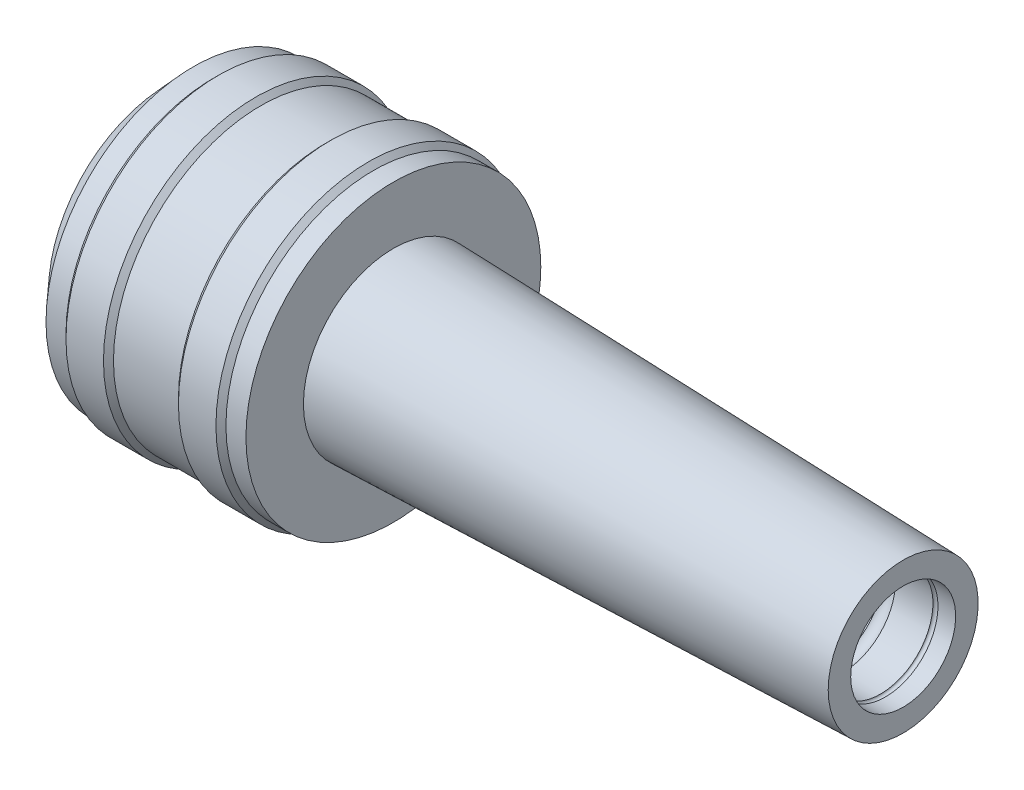
ISO-10303-21;
HEADER;
FILE_DESCRIPTION(('STEP AP214'),'2;1');
FILE_NAME('part.step','',(''),(''),'','','');
FILE_SCHEMA(('AUTOMOTIVE_DESIGN { 1 0 10303 214 1 1 1 1 }'));
ENDSEC;
DATA;
#1=APPLICATION_CONTEXT('core data for automotive mechanical design processes');
#2=APPLICATION_PROTOCOL_DEFINITION('international standard','automotive_design',2000,#1);
#3=PRODUCT_CONTEXT('',#1,'mechanical');
#4=PRODUCT('Part','Part','',(#3));
#5=PRODUCT_RELATED_PRODUCT_CATEGORY('part','',(#4));
#6=PRODUCT_DEFINITION_FORMATION('','',#4);
#7=PRODUCT_DEFINITION_CONTEXT('part definition',#1,'design');
#8=PRODUCT_DEFINITION('design','',#6,#7);
#9=PRODUCT_DEFINITION_SHAPE('','',#8);
#10=(LENGTH_UNIT() NAMED_UNIT(*) SI_UNIT(.MILLI.,.METRE.));
#11=(NAMED_UNIT(*) PLANE_ANGLE_UNIT() SI_UNIT($,.RADIAN.));
#12=(NAMED_UNIT(*) SI_UNIT($,.STERADIAN.) SOLID_ANGLE_UNIT());
#13=UNCERTAINTY_MEASURE_WITH_UNIT(LENGTH_MEASURE(1.E-05),#10,'distance_accuracy_value','');
#14=(GEOMETRIC_REPRESENTATION_CONTEXT(3) GLOBAL_UNCERTAINTY_ASSIGNED_CONTEXT((#13)) GLOBAL_UNIT_ASSIGNED_CONTEXT((#10,
#11,#12)) REPRESENTATION_CONTEXT('',''));
#15=CARTESIAN_POINT('',(0.,0.,0.));
#16=DIRECTION('',(0.,0.,1.));
#17=DIRECTION('',(1.,0.,0.));
#18=AXIS2_PLACEMENT_3D('',#15,#16,#17);
#19=CARTESIAN_POINT('',(-69.5410466113536,0.,0.));
#20=DIRECTION('',(1.,0.,0.));
#21=DIRECTION('',(0.,0.,-1.));
#22=AXIS2_PLACEMENT_3D('',#19,#20,#21);
#23=CONICAL_SURFACE('',#22,59.,0.832981266674432);
#24=CARTESIAN_POINT('',(-79.5410466113536,0.,0.));
#25=DIRECTION('',(-1.,0.,0.));
#26=DIRECTION('',(0.,0.,1.));
#27=AXIS2_PLACEMENT_3D('',#24,#25,#26);
#28=CIRCLE('',#27,48.);
#29=CARTESIAN_POINT('',(-79.5410466113536,0.,48.));
#30=VERTEX_POINT('',#29);
#31=EDGE_CURVE('E108',#30,#30,#28,.T.);
#32=ORIENTED_EDGE('',*,*,#31,.F.);
#33=EDGE_LOOP('',(#32));
#34=FACE_BOUND('',#33,.T.);
#35=CARTESIAN_POINT('',(-69.5410466113536,0.,0.));
#36=DIRECTION('',(-1.,0.,0.));
#37=DIRECTION('',(0.,0.,1.));
#38=AXIS2_PLACEMENT_3D('',#35,#36,#37);
#39=CIRCLE('',#38,59.);
#40=CARTESIAN_POINT('',(-69.5410466113536,0.,59.));
#41=VERTEX_POINT('',#40);
#42=EDGE_CURVE('E10',#41,#41,#39,.T.);
#43=ORIENTED_EDGE('',*,*,#42,.T.);
#44=EDGE_LOOP('',(#43));
#45=FACE_BOUND('',#44,.T.);
#46=ADVANCED_FACE('F32',(#34,#45),#23,.T.);
#47=CARTESIAN_POINT('',(-185.161107321965,0.,0.));
#48=DIRECTION('',(-1.,0.,0.));
#49=DIRECTION('',(0.,0.,1.));
#50=AXIS2_PLACEMENT_3D('',#47,#48,#49);
#51=CYLINDRICAL_SURFACE('',#50,59.);
#52=ORIENTED_EDGE('',*,*,#42,.F.);
#53=EDGE_LOOP('',(#52));
#54=FACE_BOUND('',#53,.T.);
#55=CARTESIAN_POINT('',(-61.5410466113536,0.,0.));
#56=DIRECTION('',(-1.,0.,0.));
#57=DIRECTION('',(0.,0.,1.));
#58=AXIS2_PLACEMENT_3D('',#55,#56,#57);
#59=CIRCLE('',#58,59.);
#60=CARTESIAN_POINT('',(-61.5410466113536,0.,59.));
#61=VERTEX_POINT('',#60);
#62=EDGE_CURVE('E38',#61,#61,#59,.T.);
#63=ORIENTED_EDGE('',*,*,#62,.T.);
#64=EDGE_LOOP('',(#63));
#65=FACE_BOUND('',#64,.T.);
#66=ADVANCED_FACE('F115',(#54,#65),#51,.T.);
#67=CARTESIAN_POINT('',(-59.5410466113536,0.,0.));
#68=DIRECTION('',(1.,0.,0.));
#69=DIRECTION('',(0.,0.,-1.));
#70=AXIS2_PLACEMENT_3D('',#67,#68,#69);
#71=CONICAL_SURFACE('',#70,61.,0.785398163397452);
#72=ORIENTED_EDGE('',*,*,#62,.F.);
#73=EDGE_LOOP('',(#72));
#74=FACE_BOUND('',#73,.T.);
#75=CARTESIAN_POINT('',(-59.5410466113536,0.,0.));
#76=DIRECTION('',(-1.,0.,0.));
#77=DIRECTION('',(0.,0.,1.));
#78=AXIS2_PLACEMENT_3D('',#75,#76,#77);
#79=CIRCLE('',#78,61.);
#80=CARTESIAN_POINT('',(-59.5410466113536,0.,61.));
#81=VERTEX_POINT('',#80);
#82=EDGE_CURVE('E42',#81,#81,#79,.T.);
#83=ORIENTED_EDGE('',*,*,#82,.T.);
#84=EDGE_LOOP('',(#83));
#85=FACE_BOUND('',#84,.T.);
#86=ADVANCED_FACE('F119',(#74,#85),#71,.T.);
#87=CARTESIAN_POINT('',(-185.161107321965,0.,0.));
#88=DIRECTION('',(-1.,0.,0.));
#89=DIRECTION('',(0.,0.,1.));
#90=AXIS2_PLACEMENT_3D('',#87,#88,#89);
#91=CYLINDRICAL_SURFACE('',#90,61.);
#92=ORIENTED_EDGE('',*,*,#82,.F.);
#93=EDGE_LOOP('',(#92));
#94=FACE_BOUND('',#93,.T.);
#95=CARTESIAN_POINT('',(-44.5410466113536,0.,0.));
#96=DIRECTION('',(-1.,0.,0.));
#97=DIRECTION('',(0.,0.,1.));
#98=AXIS2_PLACEMENT_3D('',#95,#96,#97);
#99=CIRCLE('',#98,61.);
#100=CARTESIAN_POINT('',(-44.5410466113536,0.,61.));
#101=VERTEX_POINT('',#100);
#102=EDGE_CURVE('E46',#101,#101,#99,.T.);
#103=ORIENTED_EDGE('',*,*,#102,.T.);
#104=EDGE_LOOP('',(#103));
#105=FACE_BOUND('',#104,.T.);
#106=ADVANCED_FACE('F124',(#94,#105),#91,.T.);
#107=CARTESIAN_POINT('',(-42.5410466113536,0.,0.));
#108=DIRECTION('',(-1.,0.,0.));
#109=DIRECTION('',(0.,0.,1.));
#110=AXIS2_PLACEMENT_3D('',#107,#108,#109);
#111=CONICAL_SURFACE('',#110,59.,0.785398163397448);
#112=ORIENTED_EDGE('',*,*,#102,.F.);
#113=EDGE_LOOP('',(#112));
#114=FACE_BOUND('',#113,.T.);
#115=CARTESIAN_POINT('',(-42.5410466113536,0.,0.));
#116=DIRECTION('',(-1.,0.,0.));
#117=DIRECTION('',(0.,0.,1.));
#118=AXIS2_PLACEMENT_3D('',#115,#116,#117);
#119=CIRCLE('',#118,59.);
#120=CARTESIAN_POINT('',(-42.5410466113536,0.,59.));
#121=VERTEX_POINT('',#120);
#122=EDGE_CURVE('E51',#121,#121,#119,.T.);
#123=ORIENTED_EDGE('',*,*,#122,.T.);
#124=EDGE_LOOP('',(#123));
#125=FACE_BOUND('',#124,.T.);
#126=ADVANCED_FACE('F130',(#114,#125),#111,.T.);
#127=CARTESIAN_POINT('',(-185.161107321965,0.,0.));
#128=DIRECTION('',(-1.,0.,0.));
#129=DIRECTION('',(0.,0.,1.));
#130=AXIS2_PLACEMENT_3D('',#127,#128,#129);
#131=CYLINDRICAL_SURFACE('',#130,59.);
#132=ORIENTED_EDGE('',*,*,#122,.F.);
#133=EDGE_LOOP('',(#132));
#134=FACE_BOUND('',#133,.T.);
#135=CARTESIAN_POINT('',(-16.5410466113536,0.,0.));
#136=DIRECTION('',(-1.,0.,0.));
#137=DIRECTION('',(0.,0.,1.));
#138=AXIS2_PLACEMENT_3D('',#135,#136,#137);
#139=CIRCLE('',#138,59.);
#140=CARTESIAN_POINT('',(-16.5410466113536,0.,59.));
#141=VERTEX_POINT('',#140);
#142=EDGE_CURVE('E54',#141,#141,#139,.T.);
#143=ORIENTED_EDGE('',*,*,#142,.T.);
#144=EDGE_LOOP('',(#143));
#145=FACE_BOUND('',#144,.T.);
#146=ADVANCED_FACE('F134',(#134,#145),#131,.T.);
#147=CARTESIAN_POINT('',(-14.5410466113536,0.,0.));
#148=DIRECTION('',(1.,0.,0.));
#149=DIRECTION('',(0.,0.,-1.));
#150=AXIS2_PLACEMENT_3D('',#147,#148,#149);
#151=CONICAL_SURFACE('',#150,61.,0.785398163397448);
#152=ORIENTED_EDGE('',*,*,#142,.F.);
#153=EDGE_LOOP('',(#152));
#154=FACE_BOUND('',#153,.T.);
#155=CARTESIAN_POINT('',(-14.5410466113536,0.,0.));
#156=DIRECTION('',(-1.,0.,0.));
#157=DIRECTION('',(0.,0.,1.));
#158=AXIS2_PLACEMENT_3D('',#155,#156,#157);
#159=CIRCLE('',#158,61.);
#160=CARTESIAN_POINT('',(-14.5410466113536,0.,61.));
#161=VERTEX_POINT('',#160);
#162=EDGE_CURVE('E57',#161,#161,#159,.T.);
#163=ORIENTED_EDGE('',*,*,#162,.T.);
#164=EDGE_LOOP('',(#163));
#165=FACE_BOUND('',#164,.T.);
#166=ADVANCED_FACE('F138',(#154,#165),#151,.T.);
#167=CARTESIAN_POINT('',(-185.161107321965,0.,0.));
#168=DIRECTION('',(-1.,0.,0.));
#169=DIRECTION('',(0.,0.,1.));
#170=AXIS2_PLACEMENT_3D('',#167,#168,#169);
#171=CYLINDRICAL_SURFACE('',#170,61.);
#172=ORIENTED_EDGE('',*,*,#162,.F.);
#173=EDGE_LOOP('',(#172));
#174=FACE_BOUND('',#173,.T.);
#175=CARTESIAN_POINT('',(0.458953388646377,0.,0.));
#176=DIRECTION('',(-1.,0.,0.));
#177=DIRECTION('',(0.,0.,1.));
#178=AXIS2_PLACEMENT_3D('',#175,#176,#177);
#179=CIRCLE('',#178,61.);
#180=CARTESIAN_POINT('',(0.458953388646377,0.,61.));
#181=VERTEX_POINT('',#180);
#182=EDGE_CURVE('E60',#181,#181,#179,.T.);
#183=ORIENTED_EDGE('',*,*,#182,.T.);
#184=EDGE_LOOP('',(#183));
#185=FACE_BOUND('',#184,.T.);
#186=ADVANCED_FACE('F142',(#174,#185),#171,.T.);
#187=CARTESIAN_POINT('',(2.45895338864638,0.,0.));
#188=DIRECTION('',(-1.,0.,0.));
#189=DIRECTION('',(0.,0.,1.));
#190=AXIS2_PLACEMENT_3D('',#187,#188,#189);
#191=CONICAL_SURFACE('',#190,59.,0.785398163397448);
#192=ORIENTED_EDGE('',*,*,#182,.F.);
#193=EDGE_LOOP('',(#192));
#194=FACE_BOUND('',#193,.T.);
#195=CARTESIAN_POINT('',(2.45895338864638,0.,0.));
#196=DIRECTION('',(-1.,0.,0.));
#197=DIRECTION('',(0.,0.,1.));
#198=AXIS2_PLACEMENT_3D('',#195,#196,#197);
#199=CIRCLE('',#198,59.);
#200=CARTESIAN_POINT('',(2.45895338864638,0.,59.));
#201=VERTEX_POINT('',#200);
#202=EDGE_CURVE('E63',#201,#201,#199,.T.);
#203=ORIENTED_EDGE('',*,*,#202,.T.);
#204=EDGE_LOOP('',(#203));
#205=FACE_BOUND('',#204,.T.);
#206=ADVANCED_FACE('F146',(#194,#205),#191,.T.);
#207=CARTESIAN_POINT('',(-185.161107321965,0.,0.));
#208=DIRECTION('',(-1.,0.,0.));
#209=DIRECTION('',(0.,0.,1.));
#210=AXIS2_PLACEMENT_3D('',#207,#208,#209);
#211=CYLINDRICAL_SURFACE('',#210,59.);
#212=ORIENTED_EDGE('',*,*,#202,.F.);
#213=EDGE_LOOP('',(#212));
#214=FACE_BOUND('',#213,.T.);
#215=CARTESIAN_POINT('',(10.4589533886464,0.,0.));
#216=DIRECTION('',(-1.,0.,0.));
#217=DIRECTION('',(0.,0.,1.));
#218=AXIS2_PLACEMENT_3D('',#215,#216,#217);
#219=CIRCLE('',#218,59.);
#220=CARTESIAN_POINT('',(10.4589533886464,0.,59.));
#221=VERTEX_POINT('',#220);
#222=EDGE_CURVE('E66',#221,#221,#219,.T.);
#223=ORIENTED_EDGE('',*,*,#222,.T.);
#224=EDGE_LOOP('',(#223));
#225=FACE_BOUND('',#224,.T.);
#226=ADVANCED_FACE('F150',(#214,#225),#211,.T.);
#227=CARTESIAN_POINT('',(10.4589533886464,59.,0.));
#228=DIRECTION('',(-1.,0.,0.));
#229=DIRECTION('',(0.,0.,1.));
#230=AXIS2_PLACEMENT_3D('',#227,#228,#229);
#231=PLANE('',#230);
#232=ORIENTED_EDGE('',*,*,#222,.F.);
#233=EDGE_LOOP('',(#232));
#234=FACE_BOUND('',#233,.T.);
#235=CARTESIAN_POINT('',(10.4589533886464,0.,0.));
#236=DIRECTION('',(-1.,0.,0.));
#237=DIRECTION('',(0.,0.,1.));
#238=AXIS2_PLACEMENT_3D('',#235,#236,#237);
#239=CIRCLE('',#238,36.);
#240=CARTESIAN_POINT('',(10.4589533886464,0.,36.));
#241=VERTEX_POINT('',#240);
#242=EDGE_CURVE('E69',#241,#241,#239,.T.);
#243=ORIENTED_EDGE('',*,*,#242,.T.);
#244=EDGE_LOOP('',(#243));
#245=FACE_BOUND('',#244,.T.);
#246=ADVANCED_FACE('F154',(#234,#245),#231,.F.);
#247=CARTESIAN_POINT('',(214.458953388646,0.,0.));
#248=DIRECTION('',(-1.,0.,0.));
#249=DIRECTION('',(0.,0.,1.));
#250=AXIS2_PLACEMENT_3D('',#247,#248,#249);
#251=CONICAL_SURFACE('',#250,30.,0.0294032882040051);
#252=ORIENTED_EDGE('',*,*,#242,.F.);
#253=EDGE_LOOP('',(#252));
#254=FACE_BOUND('',#253,.T.);
#255=CARTESIAN_POINT('',(214.458953388646,0.,0.));
#256=DIRECTION('',(-1.,0.,0.));
#257=DIRECTION('',(0.,0.,1.));
#258=AXIS2_PLACEMENT_3D('',#255,#256,#257);
#259=CIRCLE('',#258,30.);
#260=CARTESIAN_POINT('',(214.458953388646,0.,30.));
#261=VERTEX_POINT('',#260);
#262=EDGE_CURVE('E72',#261,#261,#259,.T.);
#263=ORIENTED_EDGE('',*,*,#262,.T.);
#264=EDGE_LOOP('',(#263));
#265=FACE_BOUND('',#264,.T.);
#266=ADVANCED_FACE('F158',(#254,#265),#251,.T.);
#267=CARTESIAN_POINT('',(214.458953388646,21.,0.));
#268=DIRECTION('',(-1.,0.,0.));
#269=DIRECTION('',(0.,0.,1.));
#270=AXIS2_PLACEMENT_3D('',#267,#268,#269);
#271=PLANE('',#270);
#272=ORIENTED_EDGE('',*,*,#262,.F.);
#273=EDGE_LOOP('',(#272));
#274=FACE_BOUND('',#273,.T.);
#275=CARTESIAN_POINT('',(214.458953388646,0.,0.));
#276=DIRECTION('',(-1.,0.,0.));
#277=DIRECTION('',(0.,0.,1.));
#278=AXIS2_PLACEMENT_3D('',#275,#276,#277);
#279=CIRCLE('',#278,21.);
#280=CARTESIAN_POINT('',(214.458953388646,0.,21.));
#281=VERTEX_POINT('',#280);
#282=EDGE_CURVE('E75',#281,#281,#279,.T.);
#283=ORIENTED_EDGE('',*,*,#282,.T.);
#284=EDGE_LOOP('',(#283));
#285=FACE_BOUND('',#284,.T.);
#286=ADVANCED_FACE('F162',(#274,#285),#271,.F.);
#287=CARTESIAN_POINT('',(-185.161107321965,0.,0.));
#288=DIRECTION('',(-1.,0.,0.));
#289=DIRECTION('',(0.,0.,1.));
#290=AXIS2_PLACEMENT_3D('',#287,#288,#289);
#291=CYLINDRICAL_SURFACE('',#290,21.);
#292=ORIENTED_EDGE('',*,*,#282,.F.);
#293=EDGE_LOOP('',(#292));
#294=FACE_BOUND('',#293,.T.);
#295=CARTESIAN_POINT('',(207.378173444679,0.,0.));
#296=DIRECTION('',(-1.,0.,0.));
#297=DIRECTION('',(0.,0.,1.));
#298=AXIS2_PLACEMENT_3D('',#295,#296,#297);
#299=CIRCLE('',#298,21.);
#300=CARTESIAN_POINT('',(207.378173444679,0.,21.));
#301=VERTEX_POINT('',#300);
#302=EDGE_CURVE('E78',#301,#301,#299,.T.);
#303=ORIENTED_EDGE('',*,*,#302,.T.);
#304=EDGE_LOOP('',(#303));
#305=FACE_BOUND('',#304,.T.);
#306=ADVANCED_FACE('F166',(#294,#305),#291,.F.);
#307=CARTESIAN_POINT('',(206.378173444679,0.,0.));
#308=DIRECTION('',(-1.,0.,0.));
#309=DIRECTION('',(0.,0.,1.));
#310=AXIS2_PLACEMENT_3D('',#307,#308,#309);
#311=TOROIDAL_SURFACE('',#310,20.6972082237665,1.0448362837089);
#312=ORIENTED_EDGE('',*,*,#302,.F.);
#313=EDGE_LOOP('',(#312));
#314=FACE_BOUND('',#313,.T.);
#315=CARTESIAN_POINT('',(205.378173444679,0.,0.));
#316=DIRECTION('',(-1.,0.,0.));
#317=DIRECTION('',(0.,0.,1.));
#318=AXIS2_PLACEMENT_3D('',#315,#316,#317);
#319=CIRCLE('',#318,21.);
#320=CARTESIAN_POINT('',(205.378173444679,0.,21.));
#321=VERTEX_POINT('',#320);
#322=EDGE_CURVE('E81',#321,#321,#319,.T.);
#323=ORIENTED_EDGE('',*,*,#322,.T.);
#324=EDGE_LOOP('',(#323));
#325=FACE_BOUND('',#324,.T.);
#326=ADVANCED_FACE('F170',(#314,#325),#311,.F.);
#327=CARTESIAN_POINT('',(-185.161107321965,0.,0.));
#328=DIRECTION('',(-1.,0.,0.));
#329=DIRECTION('',(0.,0.,1.));
#330=AXIS2_PLACEMENT_3D('',#327,#328,#329);
#331=CYLINDRICAL_SURFACE('',#330,21.);
#332=ORIENTED_EDGE('',*,*,#322,.F.);
#333=EDGE_LOOP('',(#332));
#334=FACE_BOUND('',#333,.T.);
#335=CARTESIAN_POINT('',(190.378173444679,0.,0.));
#336=DIRECTION('',(-1.,0.,0.));
#337=DIRECTION('',(0.,0.,1.));
#338=AXIS2_PLACEMENT_3D('',#335,#336,#337);
#339=CIRCLE('',#338,21.);
#340=CARTESIAN_POINT('',(190.378173444679,0.,21.));
#341=VERTEX_POINT('',#340);
#342=EDGE_CURVE('E84',#341,#341,#339,.T.);
#343=ORIENTED_EDGE('',*,*,#342,.T.);
#344=EDGE_LOOP('',(#343));
#345=FACE_BOUND('',#344,.T.);
#346=ADVANCED_FACE('F174',(#334,#345),#331,.F.);
#347=CARTESIAN_POINT('',(187.878173444679,0.,0.));
#348=DIRECTION('',(-1.,0.,0.));
#349=DIRECTION('',(0.,0.,1.));
#350=AXIS2_PLACEMENT_3D('',#347,#348,#349);
#351=TOROIDAL_SURFACE('',#350,18.5,3.53553390593271);
#352=ORIENTED_EDGE('',*,*,#342,.F.);
#353=EDGE_LOOP('',(#352));
#354=FACE_BOUND('',#353,.T.);
#355=CARTESIAN_POINT('',(185.378173444679,0.,0.));
#356=DIRECTION('',(-1.,0.,0.));
#357=DIRECTION('',(0.,0.,1.));
#358=AXIS2_PLACEMENT_3D('',#355,#356,#357);
#359=CIRCLE('',#358,21.);
#360=CARTESIAN_POINT('',(185.378173444679,0.,21.));
#361=VERTEX_POINT('',#360);
#362=EDGE_CURVE('E87',#361,#361,#359,.T.);
#363=ORIENTED_EDGE('',*,*,#362,.T.);
#364=EDGE_LOOP('',(#363));
#365=FACE_BOUND('',#364,.T.);
#366=ADVANCED_FACE('F178',(#354,#365),#351,.F.);
#367=CARTESIAN_POINT('',(-185.161107321965,0.,0.));
#368=DIRECTION('',(-1.,0.,0.));
#369=DIRECTION('',(0.,0.,1.));
#370=AXIS2_PLACEMENT_3D('',#367,#368,#369);
#371=CYLINDRICAL_SURFACE('',#370,21.);
#372=ORIENTED_EDGE('',*,*,#362,.F.);
#373=EDGE_LOOP('',(#372));
#374=FACE_BOUND('',#373,.T.);
#375=CARTESIAN_POINT('',(-1.5410466113536,0.,0.));
#376=DIRECTION('',(-1.,0.,0.));
#377=DIRECTION('',(0.,0.,1.));
#378=AXIS2_PLACEMENT_3D('',#375,#376,#377);
#379=CIRCLE('',#378,21.);
#380=CARTESIAN_POINT('',(-1.5410466113536,0.,21.));
#381=VERTEX_POINT('',#380);
#382=EDGE_CURVE('E90',#381,#381,#379,.T.);
#383=ORIENTED_EDGE('',*,*,#382,.T.);
#384=EDGE_LOOP('',(#383));
#385=FACE_BOUND('',#384,.T.);
#386=ADVANCED_FACE('F182',(#374,#385),#371,.F.);
#387=CARTESIAN_POINT('',(-1.54104661135361,42.,0.));
#388=DIRECTION('',(1.,0.,0.));
#389=DIRECTION('',(0.,0.,-1.));
#390=AXIS2_PLACEMENT_3D('',#387,#388,#389);
#391=PLANE('',#390);
#392=ORIENTED_EDGE('',*,*,#382,.F.);
#393=EDGE_LOOP('',(#392));
#394=FACE_BOUND('',#393,.T.);
#395=CARTESIAN_POINT('',(-1.54104661135362,0.,0.));
#396=DIRECTION('',(-1.,0.,0.));
#397=DIRECTION('',(0.,0.,1.));
#398=AXIS2_PLACEMENT_3D('',#395,#396,#397);
#399=CIRCLE('',#398,42.);
#400=CARTESIAN_POINT('',(-1.54104661135362,0.,42.));
#401=VERTEX_POINT('',#400);
#402=EDGE_CURVE('E93',#401,#401,#399,.T.);
#403=ORIENTED_EDGE('',*,*,#402,.T.);
#404=EDGE_LOOP('',(#403));
#405=FACE_BOUND('',#404,.T.);
#406=ADVANCED_FACE('F186',(#394,#405),#391,.F.);
#407=CARTESIAN_POINT('',(-185.161107321965,0.,0.));
#408=DIRECTION('',(-1.,0.,0.));
#409=DIRECTION('',(0.,0.,1.));
#410=AXIS2_PLACEMENT_3D('',#407,#408,#409);
#411=CYLINDRICAL_SURFACE('',#410,42.);
#412=ORIENTED_EDGE('',*,*,#402,.F.);
#413=EDGE_LOOP('',(#412));
#414=FACE_BOUND('',#413,.T.);
#415=CARTESIAN_POINT('',(-29.5410466113536,0.,0.));
#416=DIRECTION('',(-1.,0.,0.));
#417=DIRECTION('',(0.,0.,1.));
#418=AXIS2_PLACEMENT_3D('',#415,#416,#417);
#419=CIRCLE('',#418,42.);
#420=CARTESIAN_POINT('',(-29.5410466113536,0.,42.));
#421=VERTEX_POINT('',#420);
#422=EDGE_CURVE('E96',#421,#421,#419,.T.);
#423=ORIENTED_EDGE('',*,*,#422,.T.);
#424=EDGE_LOOP('',(#423));
#425=FACE_BOUND('',#424,.T.);
#426=ADVANCED_FACE('F190',(#414,#425),#411,.F.);
#427=CARTESIAN_POINT('',(-29.5410466113536,49.6572946201644,0.));
#428=DIRECTION('',(1.,0.,0.));
#429=DIRECTION('',(0.,0.,-1.));
#430=AXIS2_PLACEMENT_3D('',#427,#428,#429);
#431=PLANE('',#430);
#432=ORIENTED_EDGE('',*,*,#422,.F.);
#433=EDGE_LOOP('',(#432));
#434=FACE_BOUND('',#433,.T.);
#435=CARTESIAN_POINT('',(-29.5410466113536,0.,0.));
#436=DIRECTION('',(-1.,0.,0.));
#437=DIRECTION('',(0.,0.,1.));
#438=AXIS2_PLACEMENT_3D('',#435,#436,#437);
#439=CIRCLE('',#438,49.6572946201644);
#440=CARTESIAN_POINT('',(-29.5410466113536,0.,49.6572946201644));
#441=VERTEX_POINT('',#440);
#442=EDGE_CURVE('E99',#441,#441,#439,.T.);
#443=ORIENTED_EDGE('',*,*,#442,.T.);
#444=EDGE_LOOP('',(#443));
#445=FACE_BOUND('',#444,.T.);
#446=ADVANCED_FACE('F194',(#434,#445),#431,.F.);
#447=CARTESIAN_POINT('',(-185.161107321965,0.,0.));
#448=DIRECTION('',(-1.,0.,0.));
#449=DIRECTION('',(0.,0.,1.));
#450=AXIS2_PLACEMENT_3D('',#447,#448,#449);
#451=CYLINDRICAL_SURFACE('',#450,49.6572946201644);
#452=ORIENTED_EDGE('',*,*,#442,.F.);
#453=EDGE_LOOP('',(#452));
#454=FACE_BOUND('',#453,.T.);
#455=CARTESIAN_POINT('',(-33.5410466113536,0.,0.));
#456=DIRECTION('',(-1.,0.,0.));
#457=DIRECTION('',(0.,0.,1.));
#458=AXIS2_PLACEMENT_3D('',#455,#456,#457);
#459=CIRCLE('',#458,49.6572946201644);
#460=CARTESIAN_POINT('',(-33.5410466113536,0.,49.6572946201644));
#461=VERTEX_POINT('',#460);
#462=EDGE_CURVE('E102',#461,#461,#459,.T.);
#463=ORIENTED_EDGE('',*,*,#462,.T.);
#464=EDGE_LOOP('',(#463));
#465=FACE_BOUND('',#464,.T.);
#466=ADVANCED_FACE('F198',(#454,#465),#451,.F.);
#467=CARTESIAN_POINT('',(-33.5410466113536,48.,0.));
#468=DIRECTION('',(-1.,0.,0.));
#469=DIRECTION('',(0.,0.,1.));
#470=AXIS2_PLACEMENT_3D('',#467,#468,#469);
#471=PLANE('',#470);
#472=ORIENTED_EDGE('',*,*,#462,.F.);
#473=EDGE_LOOP('',(#472));
#474=FACE_BOUND('',#473,.T.);
#475=CARTESIAN_POINT('',(-33.5410466113536,0.,0.));
#476=DIRECTION('',(-1.,0.,0.));
#477=DIRECTION('',(0.,0.,1.));
#478=AXIS2_PLACEMENT_3D('',#475,#476,#477);
#479=CIRCLE('',#478,48.);
#480=CARTESIAN_POINT('',(-33.5410466113536,0.,48.));
#481=VERTEX_POINT('',#480);
#482=EDGE_CURVE('E105',#481,#481,#479,.T.);
#483=ORIENTED_EDGE('',*,*,#482,.T.);
#484=EDGE_LOOP('',(#483));
#485=FACE_BOUND('',#484,.T.);
#486=ADVANCED_FACE('F202',(#474,#485),#471,.F.);
#487=CARTESIAN_POINT('',(-185.161107321965,0.,0.));
#488=DIRECTION('',(-1.,0.,0.));
#489=DIRECTION('',(0.,0.,1.));
#490=AXIS2_PLACEMENT_3D('',#487,#488,#489);
#491=CYLINDRICAL_SURFACE('',#490,48.);
#492=ORIENTED_EDGE('',*,*,#482,.F.);
#493=EDGE_LOOP('',(#492));
#494=FACE_BOUND('',#493,.T.);
#495=ORIENTED_EDGE('',*,*,#31,.T.);
#496=EDGE_LOOP('',(#495));
#497=FACE_BOUND('',#496,.T.);
#498=ADVANCED_FACE('F112',(#494,#497),#491,.F.);
#499=CLOSED_SHELL('',(#46,#66,#86,#106,#126,#146,#166,#186,#206,#226,#246,#266,#286,#306,#326,
#346,#366,#386,#406,#426,#446,#466,#486,#498));
#500=MANIFOLD_SOLID_BREP('B2',#499);
#501=ADVANCED_BREP_SHAPE_REPRESENTATION('',(#18,#500),#14);
#502=SHAPE_DEFINITION_REPRESENTATION(#9,#501);
ENDSEC;
END-ISO-10303-21;
